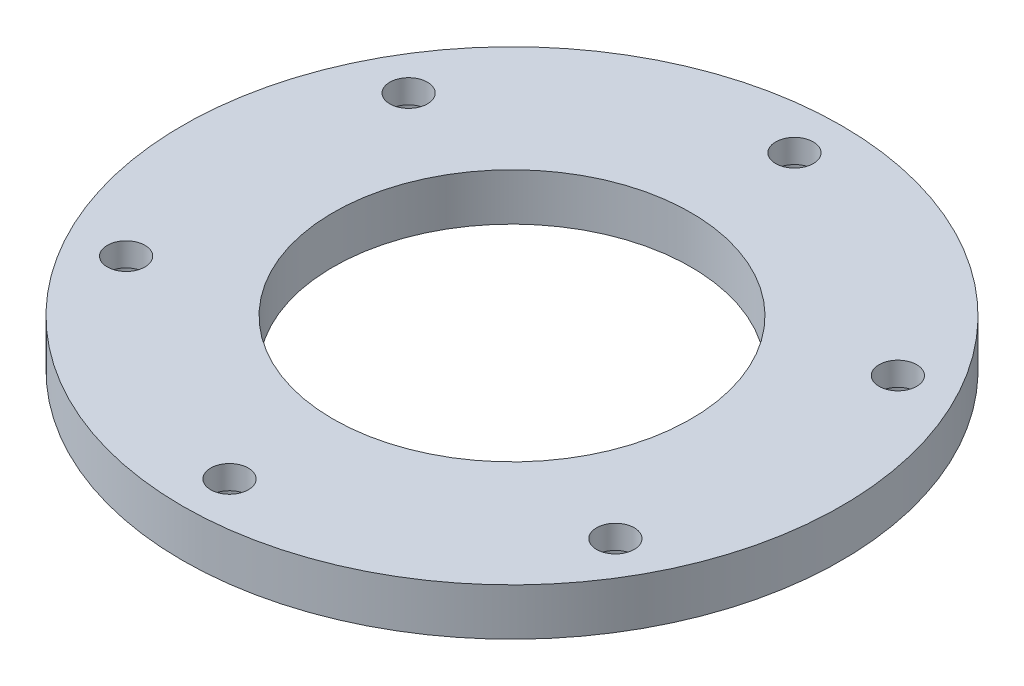
ISO-10303-21;
HEADER;
FILE_DESCRIPTION(('STEP AP214'),'2;1');
FILE_NAME('part.step','',(''),(''),'','','');
FILE_SCHEMA(('AUTOMOTIVE_DESIGN { 1 0 10303 214 1 1 1 1 }'));
ENDSEC;
DATA;
#1=APPLICATION_CONTEXT('core data for automotive mechanical design processes');
#2=APPLICATION_PROTOCOL_DEFINITION('international standard','automotive_design',2000,#1);
#3=PRODUCT_CONTEXT('',#1,'mechanical');
#4=PRODUCT('Part','Part','',(#3));
#5=PRODUCT_RELATED_PRODUCT_CATEGORY('part','',(#4));
#6=PRODUCT_DEFINITION_FORMATION('','',#4);
#7=PRODUCT_DEFINITION_CONTEXT('part definition',#1,'design');
#8=PRODUCT_DEFINITION('design','',#6,#7);
#9=PRODUCT_DEFINITION_SHAPE('','',#8);
#10=(LENGTH_UNIT() NAMED_UNIT(*) SI_UNIT(.MILLI.,.METRE.));
#11=(NAMED_UNIT(*) PLANE_ANGLE_UNIT() SI_UNIT($,.RADIAN.));
#12=(NAMED_UNIT(*) SI_UNIT($,.STERADIAN.) SOLID_ANGLE_UNIT());
#13=UNCERTAINTY_MEASURE_WITH_UNIT(LENGTH_MEASURE(1.E-05),#10,'distance_accuracy_value','');
#14=(GEOMETRIC_REPRESENTATION_CONTEXT(3) GLOBAL_UNCERTAINTY_ASSIGNED_CONTEXT((#13)) GLOBAL_UNIT_ASSIGNED_CONTEXT((#10,
#11,#12)) REPRESENTATION_CONTEXT('',''));
#15=CARTESIAN_POINT('',(0.,0.,0.));
#16=DIRECTION('',(0.,0.,1.));
#17=DIRECTION('',(1.,0.,0.));
#18=AXIS2_PLACEMENT_3D('',#15,#16,#17);
#19=CARTESIAN_POINT('',(2.55060596794148E-12,5.,30.));
#20=DIRECTION('',(0.,-1.,0.));
#21=DIRECTION('',(0.,0.,-1.));
#22=AXIS2_PLACEMENT_3D('',#19,#20,#21);
#23=CYLINDRICAL_SURFACE('',#22,2.);
#24=CARTESIAN_POINT('',(2.55060596794148E-12,5.,30.));
#25=DIRECTION('',(0.,1.,0.));
#26=DIRECTION('',(0.,0.,1.));
#27=AXIS2_PLACEMENT_3D('',#24,#25,#26);
#28=CIRCLE('',#27,2.);
#29=CARTESIAN_POINT('',(2.55060596794148E-12,5.,32.));
#30=VERTEX_POINT('',#29);
#31=EDGE_CURVE('E98',#30,#30,#28,.T.);
#32=ORIENTED_EDGE('',*,*,#31,.T.);
#33=EDGE_LOOP('',(#32));
#34=FACE_BOUND('',#33,.T.);
#35=CARTESIAN_POINT('',(2.55060596794148E-12,2.5,30.));
#36=DIRECTION('',(0.,-1.,0.));
#37=DIRECTION('',(0.,0.,-1.));
#38=AXIS2_PLACEMENT_3D('',#35,#36,#37);
#39=CIRCLE('',#38,2.);
#40=CARTESIAN_POINT('',(2.55060596794148E-12,2.5,28.));
#41=VERTEX_POINT('',#40);
#42=EDGE_CURVE('E38',#41,#41,#39,.T.);
#43=ORIENTED_EDGE('',*,*,#42,.T.);
#44=EDGE_LOOP('',(#43));
#45=FACE_BOUND('',#44,.T.);
#46=ADVANCED_FACE('F34',(#34,#45),#23,.F.);
#47=CARTESIAN_POINT('',(25.9807621135351,5.,14.9999999999989));
#48=DIRECTION('',(0.,-1.,0.));
#49=DIRECTION('',(0.,0.,-1.));
#50=AXIS2_PLACEMENT_3D('',#47,#48,#49);
#51=CYLINDRICAL_SURFACE('',#50,2.);
#52=CARTESIAN_POINT('',(25.9807621135351,5.,14.9999999999989));
#53=DIRECTION('',(0.,1.,0.));
#54=DIRECTION('',(0.,0.,1.));
#55=AXIS2_PLACEMENT_3D('',#52,#53,#54);
#56=CIRCLE('',#55,2.);
#57=CARTESIAN_POINT('',(25.9807621135351,5.,16.9999999999989));
#58=VERTEX_POINT('',#57);
#59=EDGE_CURVE('E95',#58,#58,#56,.T.);
#60=ORIENTED_EDGE('',*,*,#59,.T.);
#61=EDGE_LOOP('',(#60));
#62=FACE_BOUND('',#61,.T.);
#63=CARTESIAN_POINT('',(25.9807621135351,2.5,14.9999999999989));
#64=DIRECTION('',(0.,-1.,0.));
#65=DIRECTION('',(0.,0.,-1.));
#66=AXIS2_PLACEMENT_3D('',#63,#64,#65);
#67=CIRCLE('',#66,2.);
#68=CARTESIAN_POINT('',(25.9807621135351,2.5,12.9999999999989));
#69=VERTEX_POINT('',#68);
#70=EDGE_CURVE('E71',#69,#69,#67,.T.);
#71=ORIENTED_EDGE('',*,*,#70,.T.);
#72=EDGE_LOOP('',(#71));
#73=FACE_BOUND('',#72,.T.);
#74=ADVANCED_FACE('F134',(#62,#73),#51,.F.);
#75=CARTESIAN_POINT('',(25.9807621135338,5.,-15.0000000000011));
#76=DIRECTION('',(0.,-1.,0.));
#77=DIRECTION('',(0.,0.,-1.));
#78=AXIS2_PLACEMENT_3D('',#75,#76,#77);
#79=CYLINDRICAL_SURFACE('',#78,2.);
#80=CARTESIAN_POINT('',(25.9807621135338,5.,-15.0000000000011));
#81=DIRECTION('',(0.,1.,0.));
#82=DIRECTION('',(0.,0.,1.));
#83=AXIS2_PLACEMENT_3D('',#80,#81,#82);
#84=CIRCLE('',#83,2.);
#85=CARTESIAN_POINT('',(25.9807621135338,5.,-13.0000000000011));
#86=VERTEX_POINT('',#85);
#87=EDGE_CURVE('E92',#86,#86,#84,.T.);
#88=ORIENTED_EDGE('',*,*,#87,.T.);
#89=EDGE_LOOP('',(#88));
#90=FACE_BOUND('',#89,.T.);
#91=CARTESIAN_POINT('',(25.9807621135338,2.5,-15.0000000000011));
#92=DIRECTION('',(0.,-1.,0.));
#93=DIRECTION('',(0.,0.,-1.));
#94=AXIS2_PLACEMENT_3D('',#91,#92,#93);
#95=CIRCLE('',#94,2.);
#96=CARTESIAN_POINT('',(25.9807621135338,2.5,-17.0000000000011));
#97=VERTEX_POINT('',#96);
#98=EDGE_CURVE('E69',#97,#97,#95,.T.);
#99=ORIENTED_EDGE('',*,*,#98,.T.);
#100=EDGE_LOOP('',(#99));
#101=FACE_BOUND('',#100,.T.);
#102=ADVANCED_FACE('F140',(#90,#101),#79,.F.);
#103=CARTESIAN_POINT('',(0.,5.,-30.));
#104=DIRECTION('',(0.,-1.,0.));
#105=DIRECTION('',(0.,0.,-1.));
#106=AXIS2_PLACEMENT_3D('',#103,#104,#105);
#107=CYLINDRICAL_SURFACE('',#106,2.);
#108=CARTESIAN_POINT('',(0.,5.,-30.));
#109=DIRECTION('',(0.,1.,0.));
#110=DIRECTION('',(0.,0.,1.));
#111=AXIS2_PLACEMENT_3D('',#108,#109,#110);
#112=CIRCLE('',#111,2.);
#113=CARTESIAN_POINT('',(0.,5.,-28.));
#114=VERTEX_POINT('',#113);
#115=EDGE_CURVE('E89',#114,#114,#112,.T.);
#116=ORIENTED_EDGE('',*,*,#115,.T.);
#117=EDGE_LOOP('',(#116));
#118=FACE_BOUND('',#117,.T.);
#119=CARTESIAN_POINT('',(0.,2.5,-30.));
#120=DIRECTION('',(0.,-1.,0.));
#121=DIRECTION('',(0.,0.,-1.));
#122=AXIS2_PLACEMENT_3D('',#119,#120,#121);
#123=CIRCLE('',#122,2.);
#124=CARTESIAN_POINT('',(0.,2.5,-32.));
#125=VERTEX_POINT('',#124);
#126=EDGE_CURVE('E65',#125,#125,#123,.T.);
#127=ORIENTED_EDGE('',*,*,#126,.T.);
#128=EDGE_LOOP('',(#127));
#129=FACE_BOUND('',#128,.T.);
#130=ADVANCED_FACE('F146',(#118,#129),#107,.F.);
#131=CARTESIAN_POINT('',(-25.9807621135325,5.,-14.9999999999989));
#132=DIRECTION('',(0.,-1.,0.));
#133=DIRECTION('',(0.,0.,-1.));
#134=AXIS2_PLACEMENT_3D('',#131,#132,#133);
#135=CYLINDRICAL_SURFACE('',#134,2.);
#136=CARTESIAN_POINT('',(-25.9807621135325,5.,-14.9999999999989));
#137=DIRECTION('',(0.,1.,0.));
#138=DIRECTION('',(0.,0.,1.));
#139=AXIS2_PLACEMENT_3D('',#136,#137,#138);
#140=CIRCLE('',#139,2.);
#141=CARTESIAN_POINT('',(-25.9807621135325,5.,-12.9999999999989));
#142=VERTEX_POINT('',#141);
#143=EDGE_CURVE('E58',#142,#142,#140,.T.);
#144=ORIENTED_EDGE('',*,*,#143,.T.);
#145=EDGE_LOOP('',(#144));
#146=FACE_BOUND('',#145,.T.);
#147=CARTESIAN_POINT('',(-25.9807621135325,2.5,-14.9999999999989));
#148=DIRECTION('',(0.,-1.,0.));
#149=DIRECTION('',(0.,0.,-1.));
#150=AXIS2_PLACEMENT_3D('',#147,#148,#149);
#151=CIRCLE('',#150,2.);
#152=CARTESIAN_POINT('',(-25.9807621135325,2.5,-16.9999999999989));
#153=VERTEX_POINT('',#152);
#154=EDGE_CURVE('E62',#153,#153,#151,.T.);
#155=ORIENTED_EDGE('',*,*,#154,.T.);
#156=EDGE_LOOP('',(#155));
#157=FACE_BOUND('',#156,.T.);
#158=ADVANCED_FACE('F36',(#146,#157),#135,.F.);
#159=CARTESIAN_POINT('',(-25.9807621135312,5.,15.0000000000011));
#160=DIRECTION('',(0.,-1.,0.));
#161=DIRECTION('',(0.,0.,-1.));
#162=AXIS2_PLACEMENT_3D('',#159,#160,#161);
#163=CYLINDRICAL_SURFACE('',#162,2.);
#164=CARTESIAN_POINT('',(-25.9807621135312,5.,15.0000000000011));
#165=DIRECTION('',(0.,1.,0.));
#166=DIRECTION('',(0.,0.,1.));
#167=AXIS2_PLACEMENT_3D('',#164,#165,#166);
#168=CIRCLE('',#167,2.);
#169=CARTESIAN_POINT('',(-25.9807621135312,5.,17.0000000000011));
#170=VERTEX_POINT('',#169);
#171=EDGE_CURVE('E47',#170,#170,#168,.T.);
#172=ORIENTED_EDGE('',*,*,#171,.T.);
#173=EDGE_LOOP('',(#172));
#174=FACE_BOUND('',#173,.T.);
#175=CARTESIAN_POINT('',(-25.9807621135312,2.5,15.0000000000011));
#176=DIRECTION('',(0.,-1.,0.));
#177=DIRECTION('',(0.,0.,-1.));
#178=AXIS2_PLACEMENT_3D('',#175,#176,#177);
#179=CIRCLE('',#178,2.);
#180=CARTESIAN_POINT('',(-25.9807621135312,2.5,13.0000000000011));
#181=VERTEX_POINT('',#180);
#182=EDGE_CURVE('E55',#181,#181,#179,.T.);
#183=ORIENTED_EDGE('',*,*,#182,.T.);
#184=EDGE_LOOP('',(#183));
#185=FACE_BOUND('',#184,.T.);
#186=ADVANCED_FACE('F103',(#174,#185),#163,.F.);
#187=CARTESIAN_POINT('',(0.,5.,0.));
#188=DIRECTION('',(0.,-1.,0.));
#189=DIRECTION('',(0.,0.,-1.));
#190=AXIS2_PLACEMENT_3D('',#187,#188,#189);
#191=CYLINDRICAL_SURFACE('',#190,35.);
#192=CARTESIAN_POINT('',(0.,5.,0.));
#193=DIRECTION('',(0.,1.,0.));
#194=DIRECTION('',(0.,0.,1.));
#195=AXIS2_PLACEMENT_3D('',#192,#193,#194);
#196=CIRCLE('',#195,35.);
#197=CARTESIAN_POINT('',(0.,5.,35.));
#198=VERTEX_POINT('',#197);
#199=EDGE_CURVE('E42',#198,#198,#196,.T.);
#200=ORIENTED_EDGE('',*,*,#199,.F.);
#201=EDGE_LOOP('',(#200));
#202=FACE_BOUND('',#201,.T.);
#203=CARTESIAN_POINT('',(0.,0.,0.));
#204=DIRECTION('',(0.,1.,0.));
#205=DIRECTION('',(0.,0.,1.));
#206=AXIS2_PLACEMENT_3D('',#203,#204,#205);
#207=CIRCLE('',#206,35.);
#208=CARTESIAN_POINT('',(0.,0.,35.));
#209=VERTEX_POINT('',#208);
#210=EDGE_CURVE('E51',#209,#209,#207,.T.);
#211=ORIENTED_EDGE('',*,*,#210,.T.);
#212=EDGE_LOOP('',(#211));
#213=FACE_BOUND('',#212,.T.);
#214=ADVANCED_FACE('F116',(#202,#213),#191,.T.);
#215=CARTESIAN_POINT('',(0.,5.,0.));
#216=DIRECTION('',(0.,-1.,0.));
#217=DIRECTION('',(0.,0.,-1.));
#218=AXIS2_PLACEMENT_3D('',#215,#216,#217);
#219=CYLINDRICAL_SURFACE('',#218,19.);
#220=CARTESIAN_POINT('',(0.,5.,0.));
#221=DIRECTION('',(0.,1.,0.));
#222=DIRECTION('',(0.,0.,1.));
#223=AXIS2_PLACEMENT_3D('',#220,#221,#222);
#224=CIRCLE('',#223,19.);
#225=CARTESIAN_POINT('',(0.,5.,19.));
#226=VERTEX_POINT('',#225);
#227=EDGE_CURVE('E10',#226,#226,#224,.T.);
#228=ORIENTED_EDGE('',*,*,#227,.T.);
#229=EDGE_LOOP('',(#228));
#230=FACE_BOUND('',#229,.T.);
#231=CARTESIAN_POINT('',(0.,0.,0.));
#232=DIRECTION('',(0.,1.,0.));
#233=DIRECTION('',(0.,0.,1.));
#234=AXIS2_PLACEMENT_3D('',#231,#232,#233);
#235=CIRCLE('',#234,19.);
#236=CARTESIAN_POINT('',(0.,0.,19.));
#237=VERTEX_POINT('',#236);
#238=EDGE_CURVE('E54',#237,#237,#235,.T.);
#239=ORIENTED_EDGE('',*,*,#238,.F.);
#240=EDGE_LOOP('',(#239));
#241=FACE_BOUND('',#240,.T.);
#242=ADVANCED_FACE('F110',(#230,#241),#219,.F.);
#243=CARTESIAN_POINT('',(0.,5.,0.));
#244=DIRECTION('',(0.,1.,0.));
#245=DIRECTION('',(0.,0.,1.));
#246=AXIS2_PLACEMENT_3D('',#243,#244,#245);
#247=PLANE('',#246);
#248=ORIENTED_EDGE('',*,*,#143,.F.);
#249=EDGE_LOOP('',(#248));
#250=FACE_BOUND('',#249,.T.);
#251=ORIENTED_EDGE('',*,*,#115,.F.);
#252=EDGE_LOOP('',(#251));
#253=FACE_BOUND('',#252,.T.);
#254=ORIENTED_EDGE('',*,*,#87,.F.);
#255=EDGE_LOOP('',(#254));
#256=FACE_BOUND('',#255,.T.);
#257=ORIENTED_EDGE('',*,*,#59,.F.);
#258=EDGE_LOOP('',(#257));
#259=FACE_BOUND('',#258,.T.);
#260=ORIENTED_EDGE('',*,*,#31,.F.);
#261=EDGE_LOOP('',(#260));
#262=FACE_BOUND('',#261,.T.);
#263=ORIENTED_EDGE('',*,*,#171,.F.);
#264=EDGE_LOOP('',(#263));
#265=FACE_BOUND('',#264,.T.);
#266=ORIENTED_EDGE('',*,*,#199,.T.);
#267=EDGE_LOOP('',(#266));
#268=FACE_BOUND('',#267,.T.);
#269=ORIENTED_EDGE('',*,*,#227,.F.);
#270=EDGE_LOOP('',(#269));
#271=FACE_BOUND('',#270,.T.);
#272=ADVANCED_FACE('F106',(#250,#253,#256,#259,#262,#265,#268,#271),#247,.T.);
#273=CARTESIAN_POINT('',(0.,0.,0.));
#274=DIRECTION('',(0.,1.,0.));
#275=DIRECTION('',(0.,0.,1.));
#276=AXIS2_PLACEMENT_3D('',#273,#274,#275);
#277=PLANE('',#276);
#278=CARTESIAN_POINT('',(2.55060596794148E-12,0.,30.));
#279=DIRECTION('',(0.,-1.,0.));
#280=DIRECTION('',(0.,0.,-1.));
#281=AXIS2_PLACEMENT_3D('',#278,#279,#280);
#282=CIRCLE('',#281,3.75);
#283=CARTESIAN_POINT('',(2.55060596794148E-12,0.,26.25));
#284=VERTEX_POINT('',#283);
#285=EDGE_CURVE('E184',#284,#284,#282,.T.);
#286=ORIENTED_EDGE('',*,*,#285,.F.);
#287=EDGE_LOOP('',(#286));
#288=FACE_BOUND('',#287,.T.);
#289=CARTESIAN_POINT('',(25.9807621135351,0.,14.9999999999989));
#290=DIRECTION('',(0.,-1.,0.));
#291=DIRECTION('',(0.,0.,-1.));
#292=AXIS2_PLACEMENT_3D('',#289,#290,#291);
#293=CIRCLE('',#292,3.75000000000036);
#294=CARTESIAN_POINT('',(25.9807621135351,0.,11.2499999999985));
#295=VERTEX_POINT('',#294);
#296=EDGE_CURVE('E190',#295,#295,#293,.T.);
#297=ORIENTED_EDGE('',*,*,#296,.F.);
#298=EDGE_LOOP('',(#297));
#299=FACE_BOUND('',#298,.T.);
#300=CARTESIAN_POINT('',(25.9807621135338,0.,-15.0000000000011));
#301=DIRECTION('',(0.,-1.,0.));
#302=DIRECTION('',(0.,0.,-1.));
#303=AXIS2_PLACEMENT_3D('',#300,#301,#302);
#304=CIRCLE('',#303,3.75000000000164);
#305=CARTESIAN_POINT('',(25.9807621135338,0.,-18.7500000000027));
#306=VERTEX_POINT('',#305);
#307=EDGE_CURVE('E169',#306,#306,#304,.T.);
#308=ORIENTED_EDGE('',*,*,#307,.F.);
#309=EDGE_LOOP('',(#308));
#310=FACE_BOUND('',#309,.T.);
#311=CARTESIAN_POINT('',(0.,0.,-30.));
#312=DIRECTION('',(0.,-1.,0.));
#313=DIRECTION('',(0.,0.,-1.));
#314=AXIS2_PLACEMENT_3D('',#311,#312,#313);
#315=CIRCLE('',#314,3.75000000000263);
#316=CARTESIAN_POINT('',(0.,0.,-33.7500000000026));
#317=VERTEX_POINT('',#316);
#318=EDGE_CURVE('E168',#317,#317,#315,.T.);
#319=ORIENTED_EDGE('',*,*,#318,.F.);
#320=EDGE_LOOP('',(#319));
#321=FACE_BOUND('',#320,.T.);
#322=CARTESIAN_POINT('',(-25.9807621135325,0.,-14.9999999999989));
#323=DIRECTION('',(0.,-1.,0.));
#324=DIRECTION('',(0.,0.,-1.));
#325=AXIS2_PLACEMENT_3D('',#322,#323,#324);
#326=CIRCLE('',#325,3.75000000000242);
#327=CARTESIAN_POINT('',(-25.9807621135325,0.,-18.7500000000013));
#328=VERTEX_POINT('',#327);
#329=EDGE_CURVE('E66',#328,#328,#326,.T.);
#330=ORIENTED_EDGE('',*,*,#329,.F.);
#331=EDGE_LOOP('',(#330));
#332=FACE_BOUND('',#331,.T.);
#333=CARTESIAN_POINT('',(-25.9807621135313,0.,15.0000000000011));
#334=DIRECTION('',(0.,-1.,0.));
#335=DIRECTION('',(0.,0.,-1.));
#336=AXIS2_PLACEMENT_3D('',#333,#334,#335);
#337=CIRCLE('',#336,3.75000000000129);
#338=CARTESIAN_POINT('',(-25.9807621135313,0.,11.2499999999998));
#339=VERTEX_POINT('',#338);
#340=EDGE_CURVE('E76',#339,#339,#337,.T.);
#341=ORIENTED_EDGE('',*,*,#340,.F.);
#342=EDGE_LOOP('',(#341));
#343=FACE_BOUND('',#342,.T.);
#344=ORIENTED_EDGE('',*,*,#210,.F.);
#345=EDGE_LOOP('',(#344));
#346=FACE_BOUND('',#345,.T.);
#347=ORIENTED_EDGE('',*,*,#238,.T.);
#348=EDGE_LOOP('',(#347));
#349=FACE_BOUND('',#348,.T.);
#350=ADVANCED_FACE('F109',(#288,#299,#310,#321,#332,#343,#346,#349),#277,.F.);
#351=CARTESIAN_POINT('',(-25.9807621135313,2.5,15.0000000000011));
#352=DIRECTION('',(0.,-1.,0.));
#353=DIRECTION('',(0.,0.,-1.));
#354=AXIS2_PLACEMENT_3D('',#351,#352,#353);
#355=CYLINDRICAL_SURFACE('',#354,3.75000000000129);
#356=CARTESIAN_POINT('',(-25.9807621135313,2.5,15.0000000000011));
#357=DIRECTION('',(0.,-1.,0.));
#358=DIRECTION('',(0.,0.,-1.));
#359=AXIS2_PLACEMENT_3D('',#356,#357,#358);
#360=CIRCLE('',#359,3.75000000000129);
#361=CARTESIAN_POINT('',(-25.9807621135313,2.5,11.2499999999998));
#362=VERTEX_POINT('',#361);
#363=EDGE_CURVE('E61',#362,#362,#360,.T.);
#364=ORIENTED_EDGE('',*,*,#363,.F.);
#365=EDGE_LOOP('',(#364));
#366=FACE_BOUND('',#365,.T.);
#367=ORIENTED_EDGE('',*,*,#340,.T.);
#368=EDGE_LOOP('',(#367));
#369=FACE_BOUND('',#368,.T.);
#370=ADVANCED_FACE('F124',(#366,#369),#355,.F.);
#371=CARTESIAN_POINT('',(-25.9807621135313,2.5,15.0000000000011));
#372=DIRECTION('',(0.,-1.,0.));
#373=DIRECTION('',(0.,0.,-1.));
#374=AXIS2_PLACEMENT_3D('',#371,#372,#373);
#375=PLANE('',#374);
#376=ORIENTED_EDGE('',*,*,#182,.F.);
#377=EDGE_LOOP('',(#376));
#378=FACE_BOUND('',#377,.T.);
#379=ORIENTED_EDGE('',*,*,#363,.T.);
#380=EDGE_LOOP('',(#379));
#381=FACE_BOUND('',#380,.T.);
#382=ADVANCED_FACE('F212',(#378,#381),#375,.T.);
#383=CARTESIAN_POINT('',(-25.9807621135325,2.5,-14.9999999999989));
#384=DIRECTION('',(0.,-1.,0.));
#385=DIRECTION('',(0.,0.,-1.));
#386=AXIS2_PLACEMENT_3D('',#383,#384,#385);
#387=CYLINDRICAL_SURFACE('',#386,3.75000000000242);
#388=CARTESIAN_POINT('',(-25.9807621135325,2.5,-14.9999999999989));
#389=DIRECTION('',(0.,-1.,0.));
#390=DIRECTION('',(0.,0.,-1.));
#391=AXIS2_PLACEMENT_3D('',#388,#389,#390);
#392=CIRCLE('',#391,3.75000000000242);
#393=CARTESIAN_POINT('',(-25.9807621135325,2.5,-18.7500000000013));
#394=VERTEX_POINT('',#393);
#395=EDGE_CURVE('E171',#394,#394,#392,.T.);
#396=ORIENTED_EDGE('',*,*,#395,.F.);
#397=EDGE_LOOP('',(#396));
#398=FACE_BOUND('',#397,.T.);
#399=ORIENTED_EDGE('',*,*,#329,.T.);
#400=EDGE_LOOP('',(#399));
#401=FACE_BOUND('',#400,.T.);
#402=ADVANCED_FACE('F209',(#398,#401),#387,.F.);
#403=CARTESIAN_POINT('',(-25.9807621135325,2.5,-14.9999999999989));
#404=DIRECTION('',(0.,-1.,0.));
#405=DIRECTION('',(0.,0.,-1.));
#406=AXIS2_PLACEMENT_3D('',#403,#404,#405);
#407=PLANE('',#406);
#408=ORIENTED_EDGE('',*,*,#154,.F.);
#409=EDGE_LOOP('',(#408));
#410=FACE_BOUND('',#409,.T.);
#411=ORIENTED_EDGE('',*,*,#395,.T.);
#412=EDGE_LOOP('',(#411));
#413=FACE_BOUND('',#412,.T.);
#414=ADVANCED_FACE('F211',(#410,#413),#407,.T.);
#415=CARTESIAN_POINT('',(0.,2.5,-30.));
#416=DIRECTION('',(0.,-1.,0.));
#417=DIRECTION('',(0.,0.,-1.));
#418=AXIS2_PLACEMENT_3D('',#415,#416,#417);
#419=CYLINDRICAL_SURFACE('',#418,3.75000000000263);
#420=CARTESIAN_POINT('',(0.,2.5,-30.));
#421=DIRECTION('',(0.,-1.,0.));
#422=DIRECTION('',(0.,0.,-1.));
#423=AXIS2_PLACEMENT_3D('',#420,#421,#422);
#424=CIRCLE('',#423,3.75000000000263);
#425=CARTESIAN_POINT('',(0.,2.5,-33.7500000000026));
#426=VERTEX_POINT('',#425);
#427=EDGE_CURVE('E166',#426,#426,#424,.T.);
#428=ORIENTED_EDGE('',*,*,#427,.F.);
#429=EDGE_LOOP('',(#428));
#430=FACE_BOUND('',#429,.T.);
#431=ORIENTED_EDGE('',*,*,#318,.T.);
#432=EDGE_LOOP('',(#431));
#433=FACE_BOUND('',#432,.T.);
#434=ADVANCED_FACE('F162',(#430,#433),#419,.F.);
#435=CARTESIAN_POINT('',(0.,2.5,-30.));
#436=DIRECTION('',(0.,-1.,0.));
#437=DIRECTION('',(0.,0.,-1.));
#438=AXIS2_PLACEMENT_3D('',#435,#436,#437);
#439=PLANE('',#438);
#440=ORIENTED_EDGE('',*,*,#126,.F.);
#441=EDGE_LOOP('',(#440));
#442=FACE_BOUND('',#441,.T.);
#443=ORIENTED_EDGE('',*,*,#427,.T.);
#444=EDGE_LOOP('',(#443));
#445=FACE_BOUND('',#444,.T.);
#446=ADVANCED_FACE('F158',(#442,#445),#439,.T.);
#447=CARTESIAN_POINT('',(25.9807621135338,2.5,-15.0000000000011));
#448=DIRECTION('',(0.,-1.,0.));
#449=DIRECTION('',(0.,0.,-1.));
#450=AXIS2_PLACEMENT_3D('',#447,#448,#449);
#451=CYLINDRICAL_SURFACE('',#450,3.75000000000164);
#452=CARTESIAN_POINT('',(25.9807621135338,2.5,-15.0000000000011));
#453=DIRECTION('',(0.,-1.,0.));
#454=DIRECTION('',(0.,0.,-1.));
#455=AXIS2_PLACEMENT_3D('',#452,#453,#454);
#456=CIRCLE('',#455,3.75000000000164);
#457=CARTESIAN_POINT('',(25.9807621135338,2.5,-18.7500000000027));
#458=VERTEX_POINT('',#457);
#459=EDGE_CURVE('E174',#458,#458,#456,.T.);
#460=ORIENTED_EDGE('',*,*,#459,.F.);
#461=EDGE_LOOP('',(#460));
#462=FACE_BOUND('',#461,.T.);
#463=ORIENTED_EDGE('',*,*,#307,.T.);
#464=EDGE_LOOP('',(#463));
#465=FACE_BOUND('',#464,.T.);
#466=ADVANCED_FACE('F161',(#462,#465),#451,.F.);
#467=CARTESIAN_POINT('',(25.9807621135338,2.5,-15.0000000000011));
#468=DIRECTION('',(0.,-1.,0.));
#469=DIRECTION('',(0.,0.,-1.));
#470=AXIS2_PLACEMENT_3D('',#467,#468,#469);
#471=PLANE('',#470);
#472=ORIENTED_EDGE('',*,*,#98,.F.);
#473=EDGE_LOOP('',(#472));
#474=FACE_BOUND('',#473,.T.);
#475=ORIENTED_EDGE('',*,*,#459,.T.);
#476=EDGE_LOOP('',(#475));
#477=FACE_BOUND('',#476,.T.);
#478=ADVANCED_FACE('F196',(#474,#477),#471,.T.);
#479=CARTESIAN_POINT('',(25.9807621135351,2.5,14.9999999999989));
#480=DIRECTION('',(0.,-1.,0.));
#481=DIRECTION('',(0.,0.,-1.));
#482=AXIS2_PLACEMENT_3D('',#479,#480,#481);
#483=CYLINDRICAL_SURFACE('',#482,3.75000000000036);
#484=CARTESIAN_POINT('',(25.9807621135351,2.5,14.9999999999989));
#485=DIRECTION('',(0.,-1.,0.));
#486=DIRECTION('',(0.,0.,-1.));
#487=AXIS2_PLACEMENT_3D('',#484,#485,#486);
#488=CIRCLE('',#487,3.75000000000036);
#489=CARTESIAN_POINT('',(25.9807621135351,2.5,11.2499999999985));
#490=VERTEX_POINT('',#489);
#491=EDGE_CURVE('E187',#490,#490,#488,.T.);
#492=ORIENTED_EDGE('',*,*,#491,.F.);
#493=EDGE_LOOP('',(#492));
#494=FACE_BOUND('',#493,.T.);
#495=ORIENTED_EDGE('',*,*,#296,.T.);
#496=EDGE_LOOP('',(#495));
#497=FACE_BOUND('',#496,.T.);
#498=ADVANCED_FACE('F279',(#494,#497),#483,.F.);
#499=CARTESIAN_POINT('',(25.9807621135351,2.5,14.9999999999989));
#500=DIRECTION('',(0.,-1.,0.));
#501=DIRECTION('',(0.,0.,-1.));
#502=AXIS2_PLACEMENT_3D('',#499,#500,#501);
#503=PLANE('',#502);
#504=ORIENTED_EDGE('',*,*,#70,.F.);
#505=EDGE_LOOP('',(#504));
#506=FACE_BOUND('',#505,.T.);
#507=ORIENTED_EDGE('',*,*,#491,.T.);
#508=EDGE_LOOP('',(#507));
#509=FACE_BOUND('',#508,.T.);
#510=ADVANCED_FACE('F289',(#506,#509),#503,.T.);
#511=CARTESIAN_POINT('',(2.55060596794148E-12,2.5,30.));
#512=DIRECTION('',(0.,-1.,0.));
#513=DIRECTION('',(0.,0.,-1.));
#514=AXIS2_PLACEMENT_3D('',#511,#512,#513);
#515=CYLINDRICAL_SURFACE('',#514,3.75);
#516=CARTESIAN_POINT('',(2.55060596794148E-12,2.5,30.));
#517=DIRECTION('',(0.,-1.,0.));
#518=DIRECTION('',(0.,0.,-1.));
#519=AXIS2_PLACEMENT_3D('',#516,#517,#518);
#520=CIRCLE('',#519,3.75);
#521=CARTESIAN_POINT('',(2.55060596794148E-12,2.5,26.25));
#522=VERTEX_POINT('',#521);
#523=EDGE_CURVE('E181',#522,#522,#520,.T.);
#524=ORIENTED_EDGE('',*,*,#523,.F.);
#525=EDGE_LOOP('',(#524));
#526=FACE_BOUND('',#525,.T.);
#527=ORIENTED_EDGE('',*,*,#285,.T.);
#528=EDGE_LOOP('',(#527));
#529=FACE_BOUND('',#528,.T.);
#530=ADVANCED_FACE('F299',(#526,#529),#515,.F.);
#531=CARTESIAN_POINT('',(2.55060596794148E-12,2.5,30.));
#532=DIRECTION('',(0.,-1.,0.));
#533=DIRECTION('',(0.,0.,-1.));
#534=AXIS2_PLACEMENT_3D('',#531,#532,#533);
#535=PLANE('',#534);
#536=ORIENTED_EDGE('',*,*,#42,.F.);
#537=EDGE_LOOP('',(#536));
#538=FACE_BOUND('',#537,.T.);
#539=ORIENTED_EDGE('',*,*,#523,.T.);
#540=EDGE_LOOP('',(#539));
#541=FACE_BOUND('',#540,.T.);
#542=ADVANCED_FACE('F225',(#538,#541),#535,.T.);
#543=CLOSED_SHELL('',(#46,#74,#102,#130,#158,#186,#214,#242,#272,#350,#370,#382,#402,#414,#434,
#446,#466,#478,#498,#510,#530,#542));
#544=MANIFOLD_SOLID_BREP('B2',#543);
#545=ADVANCED_BREP_SHAPE_REPRESENTATION('',(#18,#544),#14);
#546=SHAPE_DEFINITION_REPRESENTATION(#9,#545);
ENDSEC;
END-ISO-10303-21;
